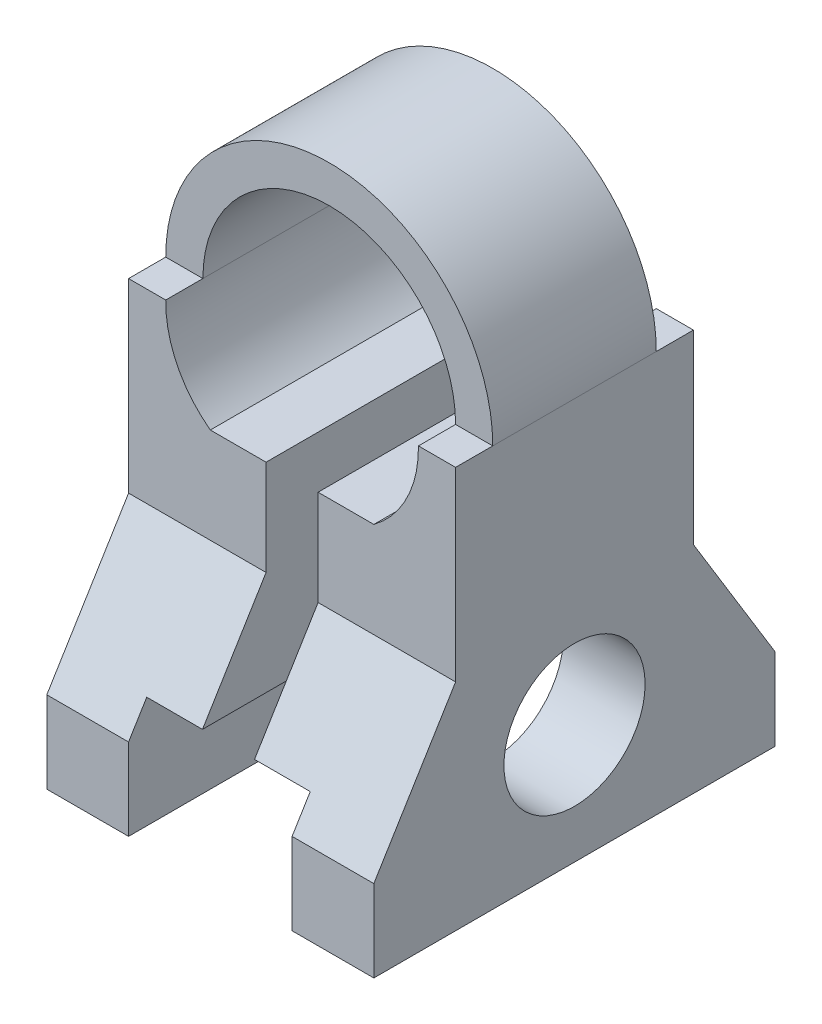
ISO-10303-21;
HEADER;
FILE_DESCRIPTION(('STEP AP214'),'2;1');
FILE_NAME('part.step','',(''),(''),'','','');
FILE_SCHEMA(('AUTOMOTIVE_DESIGN { 1 0 10303 214 1 1 1 1 }'));
ENDSEC;
DATA;
#1=APPLICATION_CONTEXT('core data for automotive mechanical design processes');
#2=APPLICATION_PROTOCOL_DEFINITION('international standard','automotive_design',2000,#1);
#3=PRODUCT_CONTEXT('',#1,'mechanical');
#4=PRODUCT('Part','Part','',(#3));
#5=PRODUCT_RELATED_PRODUCT_CATEGORY('part','',(#4));
#6=PRODUCT_DEFINITION_FORMATION('','',#4);
#7=PRODUCT_DEFINITION_CONTEXT('part definition',#1,'design');
#8=PRODUCT_DEFINITION('design','',#6,#7);
#9=PRODUCT_DEFINITION_SHAPE('','',#8);
#10=(LENGTH_UNIT() NAMED_UNIT(*) SI_UNIT(.MILLI.,.METRE.));
#11=(NAMED_UNIT(*) PLANE_ANGLE_UNIT() SI_UNIT($,.RADIAN.));
#12=(NAMED_UNIT(*) SI_UNIT($,.STERADIAN.) SOLID_ANGLE_UNIT());
#13=UNCERTAINTY_MEASURE_WITH_UNIT(LENGTH_MEASURE(1.E-05),#10,'distance_accuracy_value','');
#14=(GEOMETRIC_REPRESENTATION_CONTEXT(3) GLOBAL_UNCERTAINTY_ASSIGNED_CONTEXT((#13)) GLOBAL_UNIT_ASSIGNED_CONTEXT((#10,
#11,#12)) REPRESENTATION_CONTEXT('',''));
#15=CARTESIAN_POINT('',(0.,0.,0.));
#16=DIRECTION('',(0.,0.,1.));
#17=DIRECTION('',(1.,0.,0.));
#18=AXIS2_PLACEMENT_3D('',#15,#16,#17);
#19=CARTESIAN_POINT('',(-18.5,15.,26.3915962500495));
#20=DIRECTION('',(0.,1.,0.));
#21=DIRECTION('',(0.,0.,1.));
#22=AXIS2_PLACEMENT_3D('',#19,#20,#21);
#23=PLANE('',#22);
#24=DIRECTION('',(0.,0.,1.));
#25=VECTOR('',#24,1.);
#26=CARTESIAN_POINT('',(-18.5,15.,26.3915962500495));
#27=LINE('',#26,#25);
#28=CARTESIAN_POINT('',(-18.5,15.,11.2832625083395));
#29=VERTEX_POINT('',#28);
#30=CARTESIAN_POINT('',(-18.5,15.,26.3915962500495));
#31=VERTEX_POINT('',#30);
#32=EDGE_CURVE('E399',#29,#31,#27,.T.);
#33=ORIENTED_EDGE('',*,*,#32,.F.);
#34=DIRECTION('',(1.,0.,0.));
#35=VECTOR('',#34,1.);
#36=CARTESIAN_POINT('',(-44.,15.,11.2832625083395));
#37=LINE('',#36,#35);
#38=CARTESIAN_POINT('',(-11.,15.,11.2832625083395));
#39=VERTEX_POINT('',#38);
#40=EDGE_CURVE('E52',#29,#39,#37,.T.);
#41=ORIENTED_EDGE('',*,*,#40,.T.);
#42=DIRECTION('',(0.,0.,1.));
#43=VECTOR('',#42,1.);
#44=CARTESIAN_POINT('',(-11.,15.,26.3915962500495));
#45=LINE('',#44,#43);
#46=CARTESIAN_POINT('',(-11.,15.,26.3915962500495));
#47=VERTEX_POINT('',#46);
#48=EDGE_CURVE('E392',#39,#47,#45,.T.);
#49=ORIENTED_EDGE('',*,*,#48,.T.);
#50=DIRECTION('',(1.,0.,0.));
#51=VECTOR('',#50,1.);
#52=CARTESIAN_POINT('',(-18.5,15.,26.3915962500495));
#53=LINE('',#52,#51);
#54=EDGE_CURVE('E407',#31,#47,#53,.T.);
#55=ORIENTED_EDGE('',*,*,#54,.F.);
#56=EDGE_LOOP('',(#33,#41,#49,#55));
#57=FACE_BOUND('',#56,.T.);
#58=ADVANCED_FACE('F37',(#57),#23,.F.);
#59=CARTESIAN_POINT('',(-25.5,15.,26.3915962500495));
#60=DIRECTION('',(0.,1.,0.));
#61=DIRECTION('',(0.,0.,1.));
#62=AXIS2_PLACEMENT_3D('',#59,#60,#61);
#63=PLANE('',#62);
#64=DIRECTION('',(0.,0.,1.));
#65=VECTOR('',#64,1.);
#66=CARTESIAN_POINT('',(-33.,15.,26.3915962500495));
#67=LINE('',#66,#65);
#68=CARTESIAN_POINT('',(-33.,15.,11.2832625083395));
#69=VERTEX_POINT('',#68);
#70=CARTESIAN_POINT('',(-33.,15.,26.3915962500495));
#71=VERTEX_POINT('',#70);
#72=EDGE_CURVE('E256',#69,#71,#67,.T.);
#73=ORIENTED_EDGE('',*,*,#72,.F.);
#74=DIRECTION('',(1.,0.,0.));
#75=VECTOR('',#74,1.);
#76=CARTESIAN_POINT('',(-44.,15.,11.2832625083395));
#77=LINE('',#76,#75);
#78=CARTESIAN_POINT('',(-25.5,15.,11.2832625083395));
#79=VERTEX_POINT('',#78);
#80=EDGE_CURVE('E245',#69,#79,#77,.T.);
#81=ORIENTED_EDGE('',*,*,#80,.T.);
#82=DIRECTION('',(0.,0.,1.));
#83=VECTOR('',#82,1.);
#84=CARTESIAN_POINT('',(-25.5,15.,26.3915962500495));
#85=LINE('',#84,#83);
#86=CARTESIAN_POINT('',(-25.5,15.,26.3915962500495));
#87=VERTEX_POINT('',#86);
#88=EDGE_CURVE('E254',#79,#87,#85,.T.);
#89=ORIENTED_EDGE('',*,*,#88,.T.);
#90=DIRECTION('',(-1.,0.,0.));
#91=VECTOR('',#90,1.);
#92=CARTESIAN_POINT('',(-25.5,15.,26.3915962500495));
#93=LINE('',#92,#91);
#94=EDGE_CURVE('E272',#87,#71,#93,.T.);
#95=ORIENTED_EDGE('',*,*,#94,.T.);
#96=EDGE_LOOP('',(#73,#81,#89,#95));
#97=FACE_BOUND('',#96,.T.);
#98=ADVANCED_FACE('F252',(#97),#63,.F.);
#99=CARTESIAN_POINT('',(-11.,54.,17.8360406944939));
#100=DIRECTION('',(0.,1.,0.));
#101=DIRECTION('',(0.,0.,1.));
#102=AXIS2_PLACEMENT_3D('',#99,#100,#101);
#103=PLANE('',#102);
#104=DIRECTION('',(0.,0.,1.));
#105=VECTOR('',#104,1.);
#106=CARTESIAN_POINT('',(0.,54.,17.8360406944939));
#107=LINE('',#106,#105);
#108=CARTESIAN_POINT('',(0.,54.,12.8360406944939));
#109=VERTEX_POINT('',#108);
#110=CARTESIAN_POINT('',(0.,54.,17.8360406944939));
#111=VERTEX_POINT('',#110);
#112=EDGE_CURVE('E443',#109,#111,#107,.T.);
#113=ORIENTED_EDGE('',*,*,#112,.F.);
#114=DIRECTION('',(1.,0.,0.));
#115=VECTOR('',#114,1.);
#116=CARTESIAN_POINT('',(-5.,54.,12.8360406944939));
#117=LINE('',#116,#115);
#118=CARTESIAN_POINT('',(-5.,54.,12.8360406944939));
#119=VERTEX_POINT('',#118);
#120=EDGE_CURVE('E340',#119,#109,#117,.T.);
#121=ORIENTED_EDGE('',*,*,#120,.F.);
#122=DIRECTION('',(0.,0.,1.));
#123=VECTOR('',#122,1.);
#124=CARTESIAN_POINT('',(-5.,54.,-14.1639593055061));
#125=LINE('',#124,#123);
#126=CARTESIAN_POINT('',(-5.,54.,17.8360406944939));
#127=VERTEX_POINT('',#126);
#128=EDGE_CURVE('E386',#119,#127,#125,.T.);
#129=ORIENTED_EDGE('',*,*,#128,.T.);
#130=DIRECTION('',(1.,0.,0.));
#131=VECTOR('',#130,1.);
#132=CARTESIAN_POINT('',(-11.,54.,17.8360406944939));
#133=LINE('',#132,#131);
#134=EDGE_CURVE('E460',#127,#111,#133,.T.);
#135=ORIENTED_EDGE('',*,*,#134,.T.);
#136=EDGE_LOOP('',(#113,#121,#129,#135));
#137=FACE_BOUND('',#136,.T.);
#138=ADVANCED_FACE('F626',(#137),#103,.T.);
#139=CARTESIAN_POINT('',(-11.,29.,17.8360406944939));
#140=DIRECTION('',(0.,0.,1.));
#141=DIRECTION('',(1.,0.,0.));
#142=AXIS2_PLACEMENT_3D('',#139,#140,#141);
#143=PLANE('',#142);
#144=ORIENTED_EDGE('',*,*,#134,.F.);
#145=CARTESIAN_POINT('',(-19.8242238552265,53.7668014697038,17.8360406944939));
#146=DIRECTION('',(0.,0.,1.));
#147=DIRECTION('',(1.,0.,0.));
#148=AXIS2_PLACEMENT_3D('',#145,#146,#147);
#149=CIRCLE('',#148,14.8260579543046);
#150=CARTESIAN_POINT('',(-11.,41.8527313080315,17.8360406944939));
#151=VERTEX_POINT('',#150);
#152=EDGE_CURVE('E382',#127,#151,#149,.F.);
#153=ORIENTED_EDGE('',*,*,#152,.T.);
#154=DIRECTION('',(-1.,0.,0.));
#155=VECTOR('',#154,1.);
#156=CARTESIAN_POINT('',(-18.5,41.8527313080315,17.8360406944939));
#157=LINE('',#156,#155);
#158=CARTESIAN_POINT('',(-18.5,41.8527313080315,17.8360406944939));
#159=VERTEX_POINT('',#158);
#160=EDGE_CURVE('E361',#151,#159,#157,.T.);
#161=ORIENTED_EDGE('',*,*,#160,.T.);
#162=DIRECTION('',(0.,-1.,0.));
#163=VECTOR('',#162,1.);
#164=CARTESIAN_POINT('',(-18.5,29.,17.8360406944939));
#165=LINE('',#164,#163);
#166=CARTESIAN_POINT('',(-18.5,29.,17.8360406944939));
#167=VERTEX_POINT('',#166);
#168=EDGE_CURVE('E373',#159,#167,#165,.T.);
#169=ORIENTED_EDGE('',*,*,#168,.T.);
#170=DIRECTION('',(1.,0.,0.));
#171=VECTOR('',#170,1.);
#172=CARTESIAN_POINT('',(-11.,29.,17.8360406944939));
#173=LINE('',#172,#171);
#174=CARTESIAN_POINT('',(0.,29.,17.8360406944939));
#175=VERTEX_POINT('',#174);
#176=EDGE_CURVE('E458',#167,#175,#173,.T.);
#177=ORIENTED_EDGE('',*,*,#176,.T.);
#178=DIRECTION('',(0.,-1.,0.));
#179=VECTOR('',#178,1.);
#180=CARTESIAN_POINT('',(0.,29.,17.8360406944939));
#181=LINE('',#180,#179);
#182=EDGE_CURVE('E447',#111,#175,#181,.T.);
#183=ORIENTED_EDGE('',*,*,#182,.F.);
#184=EDGE_LOOP('',(#144,#153,#161,#169,#177,#183));
#185=FACE_BOUND('',#184,.T.);
#186=ADVANCED_FACE('F650',(#185),#143,.T.);
#187=DIRECTION('',(1.,0.,0.));
#188=VECTOR('',#187,1.);
#189=CARTESIAN_POINT('',(-5.,54.,-9.1639593055061));
#190=LINE('',#189,#188);
#191=CARTESIAN_POINT('',(-5.,54.,-9.1639593055061));
#192=VERTEX_POINT('',#191);
#193=CARTESIAN_POINT('',(0.,54.,-9.1639593055061));
#194=VERTEX_POINT('',#193);
#195=EDGE_CURVE('E345',#192,#194,#190,.T.);
#196=ORIENTED_EDGE('',*,*,#195,.T.);
#197=CARTESIAN_POINT('',(0.,54.,-14.1639593055061));
#198=VERTEX_POINT('',#197);
#199=EDGE_CURVE('E444',#198,#194,#107,.T.);
#200=ORIENTED_EDGE('',*,*,#199,.F.);
#201=DIRECTION('',(1.,0.,0.));
#202=VECTOR('',#201,1.);
#203=CARTESIAN_POINT('',(-11.,54.,-14.1639593055061));
#204=LINE('',#203,#202);
#205=CARTESIAN_POINT('',(-5.,54.,-14.1639593055061));
#206=VERTEX_POINT('',#205);
#207=EDGE_CURVE('E463',#206,#198,#204,.T.);
#208=ORIENTED_EDGE('',*,*,#207,.F.);
#209=EDGE_CURVE('E393',#206,#192,#125,.T.);
#210=ORIENTED_EDGE('',*,*,#209,.T.);
#211=EDGE_LOOP('',(#196,#200,#208,#210));
#212=FACE_BOUND('',#211,.T.);
#213=ADVANCED_FACE('F653',(#212),#103,.T.);
#214=CARTESIAN_POINT('',(-11.,54.,-14.1639593055061));
#215=DIRECTION('',(0.,0.,-1.));
#216=DIRECTION('',(0.,1.,0.));
#217=AXIS2_PLACEMENT_3D('',#214,#215,#216);
#218=PLANE('',#217);
#219=DIRECTION('',(1.,0.,0.));
#220=VECTOR('',#219,1.);
#221=CARTESIAN_POINT('',(-11.,29.,-14.1639593055061));
#222=LINE('',#221,#220);
#223=CARTESIAN_POINT('',(-18.5,29.,-14.1639593055061));
#224=VERTEX_POINT('',#223);
#225=CARTESIAN_POINT('',(0.,29.,-14.1639593055061));
#226=VERTEX_POINT('',#225);
#227=EDGE_CURVE('E465',#224,#226,#222,.T.);
#228=ORIENTED_EDGE('',*,*,#227,.F.);
#229=DIRECTION('',(0.,-1.,0.));
#230=VECTOR('',#229,1.);
#231=CARTESIAN_POINT('',(-18.5,29.,-14.1639593055061));
#232=LINE('',#231,#230);
#233=CARTESIAN_POINT('',(-18.5,41.8527313080315,-14.1639593055061));
#234=VERTEX_POINT('',#233);
#235=EDGE_CURVE('E372',#234,#224,#232,.T.);
#236=ORIENTED_EDGE('',*,*,#235,.F.);
#237=DIRECTION('',(-1.,0.,0.));
#238=VECTOR('',#237,1.);
#239=CARTESIAN_POINT('',(-18.5,41.8527313080315,-14.1639593055061));
#240=LINE('',#239,#238);
#241=CARTESIAN_POINT('',(-11.,41.8527313080315,-14.1639593055061));
#242=VERTEX_POINT('',#241);
#243=EDGE_CURVE('E369',#242,#234,#240,.T.);
#244=ORIENTED_EDGE('',*,*,#243,.F.);
#245=CARTESIAN_POINT('',(-19.8242238552265,53.7668014697038,-14.1639593055061));
#246=DIRECTION('',(0.,0.,1.));
#247=DIRECTION('',(1.,0.,0.));
#248=AXIS2_PLACEMENT_3D('',#245,#246,#247);
#249=CIRCLE('',#248,14.8260579543046);
#250=EDGE_CURVE('E383',#206,#242,#249,.F.);
#251=ORIENTED_EDGE('',*,*,#250,.F.);
#252=ORIENTED_EDGE('',*,*,#207,.T.);
#253=DIRECTION('',(0.,1.,0.));
#254=VECTOR('',#253,1.);
#255=CARTESIAN_POINT('',(0.,54.,-14.1639593055061));
#256=LINE('',#255,#254);
#257=EDGE_CURVE('E440',#226,#198,#256,.T.);
#258=ORIENTED_EDGE('',*,*,#257,.F.);
#259=EDGE_LOOP('',(#228,#236,#244,#251,#252,#258));
#260=FACE_BOUND('',#259,.T.);
#261=ADVANCED_FACE('F502',(#260),#218,.T.);
#262=CARTESIAN_POINT('',(-11.,0.,-25.1639593055061));
#263=DIRECTION('',(0.,-1.,0.));
#264=DIRECTION('',(0.,0.,-1.));
#265=AXIS2_PLACEMENT_3D('',#262,#263,#264);
#266=PLANE('',#265);
#267=DIRECTION('',(0.,0.,-1.));
#268=VECTOR('',#267,1.);
#269=CARTESIAN_POINT('',(0.,0.,-25.1639593055061));
#270=LINE('',#269,#268);
#271=CARTESIAN_POINT('',(0.,0.,28.8360406944939));
#272=VERTEX_POINT('',#271);
#273=CARTESIAN_POINT('',(0.,0.,-25.1639593055061));
#274=VERTEX_POINT('',#273);
#275=EDGE_CURVE('E415',#272,#274,#270,.T.);
#276=ORIENTED_EDGE('',*,*,#275,.F.);
#277=DIRECTION('',(1.,0.,0.));
#278=VECTOR('',#277,1.);
#279=CARTESIAN_POINT('',(-11.,0.,28.8360406944939));
#280=LINE('',#279,#278);
#281=CARTESIAN_POINT('',(-11.,0.,28.8360406944939));
#282=VERTEX_POINT('',#281);
#283=EDGE_CURVE('E45',#282,#272,#280,.T.);
#284=ORIENTED_EDGE('',*,*,#283,.F.);
#285=DIRECTION('',(0.,0.,-1.));
#286=VECTOR('',#285,1.);
#287=CARTESIAN_POINT('',(-11.,0.,-25.1639593055061));
#288=LINE('',#287,#286);
#289=CARTESIAN_POINT('',(-11.,0.,-25.1639593055061));
#290=VERTEX_POINT('',#289);
#291=EDGE_CURVE('E416',#282,#290,#288,.T.);
#292=ORIENTED_EDGE('',*,*,#291,.T.);
#293=DIRECTION('',(1.,0.,0.));
#294=VECTOR('',#293,1.);
#295=CARTESIAN_POINT('',(-11.,0.,-25.1639593055061));
#296=LINE('',#295,#294);
#297=EDGE_CURVE('E431',#290,#274,#296,.T.);
#298=ORIENTED_EDGE('',*,*,#297,.T.);
#299=EDGE_LOOP('',(#276,#284,#292,#298));
#300=FACE_BOUND('',#299,.T.);
#301=ADVANCED_FACE('F39',(#300),#266,.T.);
#302=CARTESIAN_POINT('',(-11.,0.,28.8360406944939));
#303=DIRECTION('',(0.,0.,1.));
#304=DIRECTION('',(1.,0.,0.));
#305=AXIS2_PLACEMENT_3D('',#302,#303,#304);
#306=PLANE('',#305);
#307=DIRECTION('',(0.,-1.,0.));
#308=VECTOR('',#307,1.);
#309=CARTESIAN_POINT('',(0.,0.,28.8360406944939));
#310=LINE('',#309,#308);
#311=CARTESIAN_POINT('',(0.,11.,28.8360406944939));
#312=VERTEX_POINT('',#311);
#313=EDGE_CURVE('E420',#312,#272,#310,.T.);
#314=ORIENTED_EDGE('',*,*,#313,.F.);
#315=DIRECTION('',(1.,0.,0.));
#316=VECTOR('',#315,1.);
#317=CARTESIAN_POINT('',(-11.,11.,28.8360406944939));
#318=LINE('',#317,#316);
#319=CARTESIAN_POINT('',(-11.,11.,28.8360406944939));
#320=VERTEX_POINT('',#319);
#321=EDGE_CURVE('E456',#320,#312,#318,.T.);
#322=ORIENTED_EDGE('',*,*,#321,.F.);
#323=DIRECTION('',(0.,-1.,0.));
#324=VECTOR('',#323,1.);
#325=CARTESIAN_POINT('',(-11.,0.,28.8360406944939));
#326=LINE('',#325,#324);
#327=EDGE_CURVE('E428',#320,#282,#326,.T.);
#328=ORIENTED_EDGE('',*,*,#327,.T.);
#329=ORIENTED_EDGE('',*,*,#283,.T.);
#330=EDGE_LOOP('',(#314,#322,#328,#329));
#331=FACE_BOUND('',#330,.T.);
#332=ADVANCED_FACE('F482',(#331),#306,.T.);
#333=CARTESIAN_POINT('',(-11.,11.,28.8360406944939));
#334=DIRECTION('',(0.,0.521450009453975,0.853281833651959));
#335=DIRECTION('',(0.,-0.853281833651959,0.521450009453975));
#336=AXIS2_PLACEMENT_3D('',#333,#334,#335);
#337=PLANE('',#336);
#338=DIRECTION('',(0.,-0.853281833651959,0.521450009453975));
#339=VECTOR('',#338,1.);
#340=CARTESIAN_POINT('',(0.,11.,28.8360406944939));
#341=LINE('',#340,#339);
#342=EDGE_CURVE('E450',#175,#312,#341,.T.);
#343=ORIENTED_EDGE('',*,*,#342,.F.);
#344=ORIENTED_EDGE('',*,*,#176,.F.);
#345=DIRECTION('',(0.,0.853281833651959,-0.521450009453975));
#346=VECTOR('',#345,1.);
#347=CARTESIAN_POINT('',(-18.5,29.,17.8360406944939));
#348=LINE('',#347,#346);
#349=EDGE_CURVE('E404',#31,#167,#348,.T.);
#350=ORIENTED_EDGE('',*,*,#349,.F.);
#351=ORIENTED_EDGE('',*,*,#54,.T.);
#352=DIRECTION('',(0.,-0.853281833651959,0.521450009453975));
#353=VECTOR('',#352,1.);
#354=CARTESIAN_POINT('',(-11.,11.,28.8360406944939));
#355=LINE('',#354,#353);
#356=EDGE_CURVE('E426',#47,#320,#355,.T.);
#357=ORIENTED_EDGE('',*,*,#356,.T.);
#358=ORIENTED_EDGE('',*,*,#321,.T.);
#359=EDGE_LOOP('',(#343,#344,#350,#351,#357,#358));
#360=FACE_BOUND('',#359,.T.);
#361=ADVANCED_FACE('F646',(#360),#337,.T.);
#362=CARTESIAN_POINT('',(-11.,29.,-14.1639593055061));
#363=DIRECTION('',(0.,0.521450009453975,-0.853281833651959));
#364=DIRECTION('',(0.,0.853281833651959,0.521450009453975));
#365=AXIS2_PLACEMENT_3D('',#362,#363,#364);
#366=PLANE('',#365);
#367=DIRECTION('',(0.,0.853281833651959,0.521450009453975));
#368=VECTOR('',#367,1.);
#369=CARTESIAN_POINT('',(0.,29.,-14.1639593055061));
#370=LINE('',#369,#368);
#371=CARTESIAN_POINT('',(0.,11.,-25.1639593055061));
#372=VERTEX_POINT('',#371);
#373=EDGE_CURVE('E437',#372,#226,#370,.T.);
#374=ORIENTED_EDGE('',*,*,#373,.F.);
#375=DIRECTION('',(1.,0.,0.));
#376=VECTOR('',#375,1.);
#377=CARTESIAN_POINT('',(-11.,11.,-25.1639593055061));
#378=LINE('',#377,#376);
#379=CARTESIAN_POINT('',(-11.,11.,-25.1639593055061));
#380=VERTEX_POINT('',#379);
#381=EDGE_CURVE('E467',#380,#372,#378,.T.);
#382=ORIENTED_EDGE('',*,*,#381,.F.);
#383=DIRECTION('',(0.,0.853281833651959,0.521450009453975));
#384=VECTOR('',#383,1.);
#385=CARTESIAN_POINT('',(-11.,29.,-14.1639593055061));
#386=LINE('',#385,#384);
#387=CARTESIAN_POINT('',(-11.,15.,-22.7195148610616));
#388=VERTEX_POINT('',#387);
#389=EDGE_CURVE('E423',#380,#388,#386,.T.);
#390=ORIENTED_EDGE('',*,*,#389,.T.);
#391=DIRECTION('',(1.,0.,0.));
#392=VECTOR('',#391,1.);
#393=CARTESIAN_POINT('',(-18.5,15.,-22.7195148610617));
#394=LINE('',#393,#392);
#395=CARTESIAN_POINT('',(-18.5,15.,-22.7195148610617));
#396=VERTEX_POINT('',#395);
#397=EDGE_CURVE('E412',#396,#388,#394,.T.);
#398=ORIENTED_EDGE('',*,*,#397,.F.);
#399=DIRECTION('',(0.,-0.853281833651959,-0.521450009453975));
#400=VECTOR('',#399,1.);
#401=CARTESIAN_POINT('',(-18.5,15.,-22.7195148610617));
#402=LINE('',#401,#400);
#403=EDGE_CURVE('E396',#224,#396,#402,.T.);
#404=ORIENTED_EDGE('',*,*,#403,.F.);
#405=ORIENTED_EDGE('',*,*,#227,.T.);
#406=EDGE_LOOP('',(#374,#382,#390,#398,#404,#405));
#407=FACE_BOUND('',#406,.T.);
#408=ADVANCED_FACE('F491',(#407),#366,.T.);
#409=CARTESIAN_POINT('',(-11.,11.,-25.1639593055061));
#410=DIRECTION('',(0.,0.,-1.));
#411=DIRECTION('',(-1.,0.,0.));
#412=AXIS2_PLACEMENT_3D('',#409,#410,#411);
#413=PLANE('',#412);
#414=DIRECTION('',(0.,1.,0.));
#415=VECTOR('',#414,1.);
#416=CARTESIAN_POINT('',(0.,11.,-25.1639593055061));
#417=LINE('',#416,#415);
#418=EDGE_CURVE('E434',#274,#372,#417,.T.);
#419=ORIENTED_EDGE('',*,*,#418,.F.);
#420=ORIENTED_EDGE('',*,*,#297,.F.);
#421=DIRECTION('',(0.,1.,0.));
#422=VECTOR('',#421,1.);
#423=CARTESIAN_POINT('',(-11.,11.,-25.1639593055061));
#424=LINE('',#423,#422);
#425=EDGE_CURVE('E419',#290,#380,#424,.T.);
#426=ORIENTED_EDGE('',*,*,#425,.T.);
#427=ORIENTED_EDGE('',*,*,#381,.T.);
#428=EDGE_LOOP('',(#419,#420,#426,#427));
#429=FACE_BOUND('',#428,.T.);
#430=ADVANCED_FACE('F474',(#429),#413,.T.);
#431=CARTESIAN_POINT('',(-11.,0.,0.));
#432=DIRECTION('',(-1.,0.,0.));
#433=DIRECTION('',(0.,0.,1.));
#434=AXIS2_PLACEMENT_3D('',#431,#432,#433);
#435=PLANE('',#434);
#436=CARTESIAN_POINT('',(-11.,16.,1.8360406944939));
#437=DIRECTION('',(-1.,0.,0.));
#438=DIRECTION('',(0.,0.,1.));
#439=AXIS2_PLACEMENT_3D('',#436,#437,#438);
#440=CIRCLE('',#439,9.5);
#441=CARTESIAN_POINT('',(-11.,15.,-7.61118111935169));
#442=VERTEX_POINT('',#441);
#443=EDGE_CURVE('E600',#442,#39,#440,.T.);
#444=ORIENTED_EDGE('',*,*,#443,.F.);
#445=EDGE_CURVE('E400',#388,#442,#45,.T.);
#446=ORIENTED_EDGE('',*,*,#445,.F.);
#447=ORIENTED_EDGE('',*,*,#389,.F.);
#448=ORIENTED_EDGE('',*,*,#425,.F.);
#449=ORIENTED_EDGE('',*,*,#291,.F.);
#450=ORIENTED_EDGE('',*,*,#327,.F.);
#451=ORIENTED_EDGE('',*,*,#356,.F.);
#452=ORIENTED_EDGE('',*,*,#48,.F.);
#453=EDGE_LOOP('',(#444,#446,#447,#448,#449,#450,#451,#452));
#454=FACE_BOUND('',#453,.T.);
#455=ADVANCED_FACE('F486',(#454),#435,.T.);
#456=CARTESIAN_POINT('',(0.,0.,0.));
#457=DIRECTION('',(-1.,0.,0.));
#458=DIRECTION('',(0.,0.,1.));
#459=AXIS2_PLACEMENT_3D('',#456,#457,#458);
#460=PLANE('',#459);
#461=CARTESIAN_POINT('',(0.,16.,1.8360406944939));
#462=DIRECTION('',(1.,0.,0.));
#463=DIRECTION('',(0.,0.,-1.));
#464=AXIS2_PLACEMENT_3D('',#461,#462,#463);
#465=CIRCLE('',#464,9.5);
#466=CARTESIAN_POINT('',(0.,16.,-7.6639593055061));
#467=VERTEX_POINT('',#466);
#468=EDGE_CURVE('E591',#467,#467,#465,.T.);
#469=ORIENTED_EDGE('',*,*,#468,.F.);
#470=EDGE_LOOP('',(#469));
#471=FACE_BOUND('',#470,.T.);
#472=ORIENTED_EDGE('',*,*,#275,.T.);
#473=ORIENTED_EDGE('',*,*,#418,.T.);
#474=ORIENTED_EDGE('',*,*,#373,.T.);
#475=ORIENTED_EDGE('',*,*,#257,.T.);
#476=ORIENTED_EDGE('',*,*,#199,.T.);
#477=DIRECTION('',(0.,0.,1.));
#478=VECTOR('',#477,1.);
#479=CARTESIAN_POINT('',(0.,54.,-9.1639593055061));
#480=LINE('',#479,#478);
#481=EDGE_CURVE('E358',#194,#109,#480,.T.);
#482=ORIENTED_EDGE('',*,*,#481,.T.);
#483=ORIENTED_EDGE('',*,*,#112,.T.);
#484=ORIENTED_EDGE('',*,*,#182,.T.);
#485=ORIENTED_EDGE('',*,*,#342,.T.);
#486=ORIENTED_EDGE('',*,*,#313,.T.);
#487=EDGE_LOOP('',(#472,#473,#474,#475,#476,#482,#483,#484,#485,#486));
#488=FACE_BOUND('',#487,.T.);
#489=ADVANCED_FACE('F477',(#471,#488),#460,.F.);
#490=ORIENTED_EDGE('',*,*,#445,.T.);
#491=DIRECTION('',(1.,0.,0.));
#492=VECTOR('',#491,1.);
#493=CARTESIAN_POINT('',(-44.,15.,-7.61118111935169));
#494=LINE('',#493,#492);
#495=CARTESIAN_POINT('',(-18.5,15.,-7.61118111935169));
#496=VERTEX_POINT('',#495);
#497=EDGE_CURVE('E496',#442,#496,#494,.F.);
#498=ORIENTED_EDGE('',*,*,#497,.T.);
#499=EDGE_CURVE('E401',#396,#496,#27,.T.);
#500=ORIENTED_EDGE('',*,*,#499,.F.);
#501=ORIENTED_EDGE('',*,*,#397,.T.);
#502=EDGE_LOOP('',(#490,#498,#500,#501));
#503=FACE_BOUND('',#502,.T.);
#504=ADVANCED_FACE('F494',(#503),#23,.F.);
#505=CARTESIAN_POINT('',(-18.5,0.,0.));
#506=DIRECTION('',(1.,0.,0.));
#507=DIRECTION('',(0.,0.,-1.));
#508=AXIS2_PLACEMENT_3D('',#505,#506,#507);
#509=PLANE('',#508);
#510=ORIENTED_EDGE('',*,*,#499,.T.);
#511=CARTESIAN_POINT('',(-18.5,16.,1.8360406944939));
#512=DIRECTION('',(1.,0.,0.));
#513=DIRECTION('',(0.,0.,-1.));
#514=AXIS2_PLACEMENT_3D('',#511,#512,#513);
#515=CIRCLE('',#514,9.5);
#516=EDGE_CURVE('E596',#496,#29,#515,.T.);
#517=ORIENTED_EDGE('',*,*,#516,.T.);
#518=ORIENTED_EDGE('',*,*,#32,.T.);
#519=ORIENTED_EDGE('',*,*,#349,.T.);
#520=ORIENTED_EDGE('',*,*,#168,.F.);
#521=DIRECTION('',(0.,0.,1.));
#522=VECTOR('',#521,1.);
#523=CARTESIAN_POINT('',(-18.5,41.8527313080315,-14.1639593055061));
#524=LINE('',#523,#522);
#525=EDGE_CURVE('E376',#234,#159,#524,.T.);
#526=ORIENTED_EDGE('',*,*,#525,.F.);
#527=ORIENTED_EDGE('',*,*,#235,.T.);
#528=ORIENTED_EDGE('',*,*,#403,.T.);
#529=EDGE_LOOP('',(#510,#517,#518,#519,#520,#526,#527,#528));
#530=FACE_BOUND('',#529,.T.);
#531=ADVANCED_FACE('F498',(#530),#509,.F.);
#532=CARTESIAN_POINT('',(-19.8242238552265,53.7668014697038,-14.1639593055061));
#533=DIRECTION('',(0.,0.,1.));
#534=DIRECTION('',(1.,0.,0.));
#535=AXIS2_PLACEMENT_3D('',#532,#533,#534);
#536=CYLINDRICAL_SURFACE('',#535,14.8260579543046);
#537=ORIENTED_EDGE('',*,*,#152,.F.);
#538=ORIENTED_EDGE('',*,*,#128,.F.);
#539=DIRECTION('',(0.,0.,1.));
#540=VECTOR('',#539,1.);
#541=CARTESIAN_POINT('',(-5.,54.,-9.1639593055061));
#542=LINE('',#541,#540);
#543=EDGE_CURVE('E362',#192,#119,#542,.T.);
#544=ORIENTED_EDGE('',*,*,#543,.F.);
#545=ORIENTED_EDGE('',*,*,#209,.F.);
#546=ORIENTED_EDGE('',*,*,#250,.T.);
#547=DIRECTION('',(0.,0.,1.));
#548=VECTOR('',#547,1.);
#549=CARTESIAN_POINT('',(-11.,41.8527313080315,-14.1639593055061));
#550=LINE('',#549,#548);
#551=EDGE_CURVE('E389',#242,#151,#550,.T.);
#552=ORIENTED_EDGE('',*,*,#551,.T.);
#553=EDGE_LOOP('',(#537,#538,#544,#545,#546,#552));
#554=FACE_BOUND('',#553,.T.);
#555=ADVANCED_FACE('F636',(#554),#536,.F.);
#556=CARTESIAN_POINT('',(-18.5,41.8527313080315,-14.1639593055061));
#557=DIRECTION('',(0.,1.,0.));
#558=DIRECTION('',(0.,0.,1.));
#559=AXIS2_PLACEMENT_3D('',#556,#557,#558);
#560=PLANE('',#559);
#561=ORIENTED_EDGE('',*,*,#160,.F.);
#562=ORIENTED_EDGE('',*,*,#551,.F.);
#563=ORIENTED_EDGE('',*,*,#243,.T.);
#564=ORIENTED_EDGE('',*,*,#525,.T.);
#565=EDGE_LOOP('',(#561,#562,#563,#564));
#566=FACE_BOUND('',#565,.T.);
#567=ADVANCED_FACE('F792',(#566),#560,.T.);
#568=CARTESIAN_POINT('',(-22.,53.9999988167024,-9.1639593055061));
#569=DIRECTION('',(0.,0.,1.));
#570=DIRECTION('',(1.,0.,0.));
#571=AXIS2_PLACEMENT_3D('',#568,#569,#570);
#572=CYLINDRICAL_SURFACE('',#571,22.);
#573=CARTESIAN_POINT('',(-22.,53.9999988167024,12.8360406944939));
#574=DIRECTION('',(0.,0.,1.));
#575=DIRECTION('',(-1.,0.,0.));
#576=AXIS2_PLACEMENT_3D('',#573,#574,#575);
#577=CIRCLE('',#576,22.);
#578=CARTESIAN_POINT('',(-44.,54.,12.8360406944939));
#579=VERTEX_POINT('',#578);
#580=EDGE_CURVE('E315',#109,#579,#577,.T.);
#581=ORIENTED_EDGE('',*,*,#580,.F.);
#582=ORIENTED_EDGE('',*,*,#481,.F.);
#583=CARTESIAN_POINT('',(-22.,53.9999988167024,-9.1639593055061));
#584=DIRECTION('',(0.,0.,1.));
#585=DIRECTION('',(-1.,0.,0.));
#586=AXIS2_PLACEMENT_3D('',#583,#584,#585);
#587=CIRCLE('',#586,22.);
#588=CARTESIAN_POINT('',(-44.,54.,-9.1639593055061));
#589=VERTEX_POINT('',#588);
#590=EDGE_CURVE('E336',#194,#589,#587,.T.);
#591=ORIENTED_EDGE('',*,*,#590,.T.);
#592=DIRECTION('',(0.,0.,1.));
#593=VECTOR('',#592,1.);
#594=CARTESIAN_POINT('',(-44.,54.,-9.1639593055061));
#595=LINE('',#594,#593);
#596=EDGE_CURVE('E347',#589,#579,#595,.T.);
#597=ORIENTED_EDGE('',*,*,#596,.T.);
#598=EDGE_LOOP('',(#581,#582,#591,#597));
#599=FACE_BOUND('',#598,.T.);
#600=ADVANCED_FACE('F511',(#599),#572,.T.);
#601=CARTESIAN_POINT('',(-22.,53.9999988167024,-9.1639593055061));
#602=DIRECTION('',(0.,0.,1.));
#603=DIRECTION('',(1.,0.,0.));
#604=AXIS2_PLACEMENT_3D('',#601,#602,#603);
#605=CYLINDRICAL_SURFACE('',#604,17.);
#606=CARTESIAN_POINT('',(-22.,53.9999988167024,12.8360406944939));
#607=DIRECTION('',(0.,0.,-1.));
#608=DIRECTION('',(-1.,0.,0.));
#609=AXIS2_PLACEMENT_3D('',#606,#607,#608);
#610=CIRCLE('',#609,17.);
#611=CARTESIAN_POINT('',(-39.,54.,12.8360406944939));
#612=VERTEX_POINT('',#611);
#613=EDGE_CURVE('E353',#612,#119,#610,.T.);
#614=ORIENTED_EDGE('',*,*,#613,.F.);
#615=DIRECTION('',(0.,0.,1.));
#616=VECTOR('',#615,1.);
#617=CARTESIAN_POINT('',(-39.,54.,-9.1639593055061));
#618=LINE('',#617,#616);
#619=CARTESIAN_POINT('',(-39.,54.,-9.1639593055061));
#620=VERTEX_POINT('',#619);
#621=EDGE_CURVE('E365',#620,#612,#618,.T.);
#622=ORIENTED_EDGE('',*,*,#621,.F.);
#623=CARTESIAN_POINT('',(-22.,53.9999988167024,-9.1639593055061));
#624=DIRECTION('',(0.,0.,-1.));
#625=DIRECTION('',(-1.,0.,0.));
#626=AXIS2_PLACEMENT_3D('',#623,#624,#625);
#627=CIRCLE('',#626,17.);
#628=EDGE_CURVE('E342',#620,#192,#627,.T.);
#629=ORIENTED_EDGE('',*,*,#628,.T.);
#630=ORIENTED_EDGE('',*,*,#543,.T.);
#631=EDGE_LOOP('',(#614,#622,#629,#630));
#632=FACE_BOUND('',#631,.T.);
#633=ADVANCED_FACE('F535',(#632),#605,.F.);
#634=CARTESIAN_POINT('',(-22.,53.9999988167024,-9.1639593055061));
#635=DIRECTION('',(0.,0.,-1.));
#636=DIRECTION('',(-1.,0.,0.));
#637=AXIS2_PLACEMENT_3D('',#634,#635,#636);
#638=PLANE('',#637);
#639=ORIENTED_EDGE('',*,*,#590,.F.);
#640=ORIENTED_EDGE('',*,*,#195,.F.);
#641=ORIENTED_EDGE('',*,*,#628,.F.);
#642=DIRECTION('',(1.,0.,0.));
#643=VECTOR('',#642,1.);
#644=CARTESIAN_POINT('',(-44.,54.,-9.1639593055061));
#645=LINE('',#644,#643);
#646=EDGE_CURVE('E339',#589,#620,#645,.T.);
#647=ORIENTED_EDGE('',*,*,#646,.F.);
#648=EDGE_LOOP('',(#639,#640,#641,#647));
#649=FACE_BOUND('',#648,.T.);
#650=ADVANCED_FACE('F515',(#649),#638,.T.);
#651=CARTESIAN_POINT('',(-22.,53.9999988167024,12.8360406944939));
#652=DIRECTION('',(0.,0.,-1.));
#653=DIRECTION('',(-1.,0.,0.));
#654=AXIS2_PLACEMENT_3D('',#651,#652,#653);
#655=PLANE('',#654);
#656=ORIENTED_EDGE('',*,*,#580,.T.);
#657=DIRECTION('',(1.,0.,0.));
#658=VECTOR('',#657,1.);
#659=CARTESIAN_POINT('',(-44.,54.,12.8360406944939));
#660=LINE('',#659,#658);
#661=EDGE_CURVE('E350',#579,#612,#660,.T.);
#662=ORIENTED_EDGE('',*,*,#661,.T.);
#663=ORIENTED_EDGE('',*,*,#613,.T.);
#664=ORIENTED_EDGE('',*,*,#120,.T.);
#665=EDGE_LOOP('',(#656,#662,#663,#664));
#666=FACE_BOUND('',#665,.T.);
#667=ADVANCED_FACE('F537',(#666),#655,.F.);
#668=CARTESIAN_POINT('',(-33.,54.,17.8360406944939));
#669=DIRECTION('',(0.,1.,0.));
#670=DIRECTION('',(0.,0.,1.));
#671=AXIS2_PLACEMENT_3D('',#668,#669,#670);
#672=PLANE('',#671);
#673=ORIENTED_EDGE('',*,*,#661,.F.);
#674=DIRECTION('',(0.,0.,1.));
#675=VECTOR('',#674,1.);
#676=CARTESIAN_POINT('',(-44.,54.,17.8360406944939));
#677=LINE('',#676,#675);
#678=CARTESIAN_POINT('',(-44.,54.,17.8360406944939));
#679=VERTEX_POINT('',#678);
#680=EDGE_CURVE('E302',#579,#679,#677,.T.);
#681=ORIENTED_EDGE('',*,*,#680,.T.);
#682=DIRECTION('',(-1.,0.,0.));
#683=VECTOR('',#682,1.);
#684=CARTESIAN_POINT('',(-33.,54.,17.8360406944939));
#685=LINE('',#684,#683);
#686=CARTESIAN_POINT('',(-39.,54.,17.8360406944939));
#687=VERTEX_POINT('',#686);
#688=EDGE_CURVE('E322',#687,#679,#685,.T.);
#689=ORIENTED_EDGE('',*,*,#688,.F.);
#690=DIRECTION('',(0.,0.,1.));
#691=VECTOR('',#690,1.);
#692=CARTESIAN_POINT('',(-39.,54.,-14.1639593055061));
#693=LINE('',#692,#691);
#694=EDGE_CURVE('E532',#612,#687,#693,.T.);
#695=ORIENTED_EDGE('',*,*,#694,.F.);
#696=EDGE_LOOP('',(#673,#681,#689,#695));
#697=FACE_BOUND('',#696,.T.);
#698=ADVANCED_FACE('F540',(#697),#672,.T.);
#699=CARTESIAN_POINT('',(-33.,29.,17.8360406944939));
#700=DIRECTION('',(0.,0.,1.));
#701=DIRECTION('',(-1.,0.,0.));
#702=AXIS2_PLACEMENT_3D('',#699,#700,#701);
#703=PLANE('',#702);
#704=ORIENTED_EDGE('',*,*,#688,.T.);
#705=DIRECTION('',(0.,-1.,0.));
#706=VECTOR('',#705,1.);
#707=CARTESIAN_POINT('',(-44.,29.,17.8360406944939));
#708=LINE('',#707,#706);
#709=CARTESIAN_POINT('',(-44.,29.,17.8360406944939));
#710=VERTEX_POINT('',#709);
#711=EDGE_CURVE('E306',#679,#710,#708,.T.);
#712=ORIENTED_EDGE('',*,*,#711,.T.);
#713=DIRECTION('',(-1.,0.,0.));
#714=VECTOR('',#713,1.);
#715=CARTESIAN_POINT('',(-33.,29.,17.8360406944939));
#716=LINE('',#715,#714);
#717=CARTESIAN_POINT('',(-25.5,29.,17.8360406944939));
#718=VERTEX_POINT('',#717);
#719=EDGE_CURVE('E319',#718,#710,#716,.T.);
#720=ORIENTED_EDGE('',*,*,#719,.F.);
#721=DIRECTION('',(0.,-1.,0.));
#722=VECTOR('',#721,1.);
#723=CARTESIAN_POINT('',(-25.5,29.,17.8360406944939));
#724=LINE('',#723,#722);
#725=CARTESIAN_POINT('',(-25.5,41.8527313080315,17.8360406944939));
#726=VERTEX_POINT('',#725);
#727=EDGE_CURVE('E605',#726,#718,#724,.T.);
#728=ORIENTED_EDGE('',*,*,#727,.F.);
#729=DIRECTION('',(1.,0.,0.));
#730=VECTOR('',#729,1.);
#731=CARTESIAN_POINT('',(-25.5,41.8527313080315,17.8360406944939));
#732=LINE('',#731,#730);
#733=CARTESIAN_POINT('',(-33.,41.8527313080315,17.8360406944939));
#734=VERTEX_POINT('',#733);
#735=EDGE_CURVE('E555',#734,#726,#732,.T.);
#736=ORIENTED_EDGE('',*,*,#735,.F.);
#737=CARTESIAN_POINT('',(-24.1757761447735,53.7668014697038,17.8360406944939));
#738=DIRECTION('',(0.,0.,-1.));
#739=DIRECTION('',(-1.,0.,0.));
#740=AXIS2_PLACEMENT_3D('',#737,#738,#739);
#741=CIRCLE('',#740,14.8260579543046);
#742=EDGE_CURVE('E552',#687,#734,#741,.F.);
#743=ORIENTED_EDGE('',*,*,#742,.F.);
#744=EDGE_LOOP('',(#704,#712,#720,#728,#736,#743));
#745=FACE_BOUND('',#744,.T.);
#746=ADVANCED_FACE('F550',(#745),#703,.T.);
#747=CARTESIAN_POINT('',(-44.,54.,-14.1639593055061));
#748=VERTEX_POINT('',#747);
#749=EDGE_CURVE('E303',#748,#589,#677,.T.);
#750=ORIENTED_EDGE('',*,*,#749,.T.);
#751=ORIENTED_EDGE('',*,*,#646,.T.);
#752=CARTESIAN_POINT('',(-39.,54.,-14.1639593055061));
#753=VERTEX_POINT('',#752);
#754=EDGE_CURVE('E521',#753,#620,#693,.T.);
#755=ORIENTED_EDGE('',*,*,#754,.F.);
#756=DIRECTION('',(-1.,0.,0.));
#757=VECTOR('',#756,1.);
#758=CARTESIAN_POINT('',(-33.,54.,-14.1639593055061));
#759=LINE('',#758,#757);
#760=EDGE_CURVE('E325',#753,#748,#759,.T.);
#761=ORIENTED_EDGE('',*,*,#760,.T.);
#762=EDGE_LOOP('',(#750,#751,#755,#761));
#763=FACE_BOUND('',#762,.T.);
#764=ADVANCED_FACE('F520',(#763),#672,.T.);
#765=CARTESIAN_POINT('',(-33.,54.,-14.1639593055061));
#766=DIRECTION('',(0.,0.,-1.));
#767=DIRECTION('',(0.,1.,0.));
#768=AXIS2_PLACEMENT_3D('',#765,#766,#767);
#769=PLANE('',#768);
#770=DIRECTION('',(-1.,0.,0.));
#771=VECTOR('',#770,1.);
#772=CARTESIAN_POINT('',(-33.,29.,-14.1639593055061));
#773=LINE('',#772,#771);
#774=CARTESIAN_POINT('',(-25.5,29.,-14.1639593055061));
#775=VERTEX_POINT('',#774);
#776=CARTESIAN_POINT('',(-44.,29.,-14.1639593055061));
#777=VERTEX_POINT('',#776);
#778=EDGE_CURVE('E328',#775,#777,#773,.T.);
#779=ORIENTED_EDGE('',*,*,#778,.T.);
#780=DIRECTION('',(0.,1.,0.));
#781=VECTOR('',#780,1.);
#782=CARTESIAN_POINT('',(-44.,54.,-14.1639593055061));
#783=LINE('',#782,#781);
#784=EDGE_CURVE('E300',#777,#748,#783,.T.);
#785=ORIENTED_EDGE('',*,*,#784,.T.);
#786=ORIENTED_EDGE('',*,*,#760,.F.);
#787=CARTESIAN_POINT('',(-24.1757761447735,53.7668014697038,-14.1639593055061));
#788=DIRECTION('',(0.,0.,-1.));
#789=DIRECTION('',(-1.,0.,0.));
#790=AXIS2_PLACEMENT_3D('',#787,#788,#789);
#791=CIRCLE('',#790,14.8260579543046);
#792=CARTESIAN_POINT('',(-33.,41.8527313080315,-14.1639593055061));
#793=VERTEX_POINT('',#792);
#794=EDGE_CURVE('E530',#753,#793,#791,.F.);
#795=ORIENTED_EDGE('',*,*,#794,.T.);
#796=DIRECTION('',(1.,0.,0.));
#797=VECTOR('',#796,1.);
#798=CARTESIAN_POINT('',(-25.5,41.8527313080315,-14.1639593055061));
#799=LINE('',#798,#797);
#800=CARTESIAN_POINT('',(-25.5,41.8527313080315,-14.1639593055061));
#801=VERTEX_POINT('',#800);
#802=EDGE_CURVE('E602',#793,#801,#799,.T.);
#803=ORIENTED_EDGE('',*,*,#802,.T.);
#804=DIRECTION('',(0.,-1.,0.));
#805=VECTOR('',#804,1.);
#806=CARTESIAN_POINT('',(-25.5,29.,-14.1639593055061));
#807=LINE('',#806,#805);
#808=EDGE_CURVE('E559',#801,#775,#807,.T.);
#809=ORIENTED_EDGE('',*,*,#808,.T.);
#810=EDGE_LOOP('',(#779,#785,#786,#795,#803,#809));
#811=FACE_BOUND('',#810,.T.);
#812=ADVANCED_FACE('F845',(#811),#769,.T.);
#813=CARTESIAN_POINT('',(-33.,0.,-25.1639593055061));
#814=DIRECTION('',(0.,-1.,0.));
#815=DIRECTION('',(0.,0.,-1.));
#816=AXIS2_PLACEMENT_3D('',#813,#814,#815);
#817=PLANE('',#816);
#818=DIRECTION('',(0.,0.,-1.));
#819=VECTOR('',#818,1.);
#820=CARTESIAN_POINT('',(-44.,0.,-25.1639593055061));
#821=LINE('',#820,#819);
#822=CARTESIAN_POINT('',(-44.,0.,28.8360406944939));
#823=VERTEX_POINT('',#822);
#824=CARTESIAN_POINT('',(-44.,0.,-25.1639593055061));
#825=VERTEX_POINT('',#824);
#826=EDGE_CURVE('E279',#823,#825,#821,.T.);
#827=ORIENTED_EDGE('',*,*,#826,.T.);
#828=DIRECTION('',(-1.,0.,0.));
#829=VECTOR('',#828,1.);
#830=CARTESIAN_POINT('',(-33.,0.,-25.1639593055061));
#831=LINE('',#830,#829);
#832=CARTESIAN_POINT('',(-33.,0.,-25.1639593055061));
#833=VERTEX_POINT('',#832);
#834=EDGE_CURVE('E293',#833,#825,#831,.T.);
#835=ORIENTED_EDGE('',*,*,#834,.F.);
#836=DIRECTION('',(0.,0.,-1.));
#837=VECTOR('',#836,1.);
#838=CARTESIAN_POINT('',(-33.,0.,-25.1639593055061));
#839=LINE('',#838,#837);
#840=CARTESIAN_POINT('',(-33.,0.,28.8360406944939));
#841=VERTEX_POINT('',#840);
#842=EDGE_CURVE('E280',#841,#833,#839,.T.);
#843=ORIENTED_EDGE('',*,*,#842,.F.);
#844=DIRECTION('',(-1.,0.,0.));
#845=VECTOR('',#844,1.);
#846=CARTESIAN_POINT('',(-33.,0.,28.8360406944939));
#847=LINE('',#846,#845);
#848=EDGE_CURVE('E312',#841,#823,#847,.T.);
#849=ORIENTED_EDGE('',*,*,#848,.T.);
#850=EDGE_LOOP('',(#827,#835,#843,#849));
#851=FACE_BOUND('',#850,.T.);
#852=ADVANCED_FACE('F578',(#851),#817,.T.);
#853=CARTESIAN_POINT('',(-33.,0.,28.8360406944939));
#854=DIRECTION('',(0.,0.,1.));
#855=DIRECTION('',(-1.,0.,0.));
#856=AXIS2_PLACEMENT_3D('',#853,#854,#855);
#857=PLANE('',#856);
#858=DIRECTION('',(0.,-1.,0.));
#859=VECTOR('',#858,1.);
#860=CARTESIAN_POINT('',(-44.,0.,28.8360406944939));
#861=LINE('',#860,#859);
#862=CARTESIAN_POINT('',(-44.,11.,28.8360406944939));
#863=VERTEX_POINT('',#862);
#864=EDGE_CURVE('E284',#863,#823,#861,.T.);
#865=ORIENTED_EDGE('',*,*,#864,.T.);
#866=ORIENTED_EDGE('',*,*,#848,.F.);
#867=DIRECTION('',(0.,-1.,0.));
#868=VECTOR('',#867,1.);
#869=CARTESIAN_POINT('',(-33.,0.,28.8360406944939));
#870=LINE('',#869,#868);
#871=CARTESIAN_POINT('',(-33.,11.,28.8360406944939));
#872=VERTEX_POINT('',#871);
#873=EDGE_CURVE('E291',#872,#841,#870,.T.);
#874=ORIENTED_EDGE('',*,*,#873,.F.);
#875=DIRECTION('',(-1.,0.,0.));
#876=VECTOR('',#875,1.);
#877=CARTESIAN_POINT('',(-33.,11.,28.8360406944939));
#878=LINE('',#877,#876);
#879=EDGE_CURVE('E316',#872,#863,#878,.T.);
#880=ORIENTED_EDGE('',*,*,#879,.T.);
#881=EDGE_LOOP('',(#865,#866,#874,#880));
#882=FACE_BOUND('',#881,.T.);
#883=ADVANCED_FACE('F573',(#882),#857,.T.);
#884=CARTESIAN_POINT('',(-33.,11.,28.8360406944939));
#885=DIRECTION('',(0.,0.521450009453975,0.853281833651959));
#886=DIRECTION('',(0.,-0.853281833651959,0.521450009453975));
#887=AXIS2_PLACEMENT_3D('',#884,#885,#886);
#888=PLANE('',#887);
#889=DIRECTION('',(0.,-0.853281833651959,0.521450009453975));
#890=VECTOR('',#889,1.);
#891=CARTESIAN_POINT('',(-44.,11.,28.8360406944939));
#892=LINE('',#891,#890);
#893=EDGE_CURVE('E309',#710,#863,#892,.T.);
#894=ORIENTED_EDGE('',*,*,#893,.T.);
#895=ORIENTED_EDGE('',*,*,#879,.F.);
#896=DIRECTION('',(0.,-0.853281833651959,0.521450009453975));
#897=VECTOR('',#896,1.);
#898=CARTESIAN_POINT('',(-33.,11.,28.8360406944939));
#899=LINE('',#898,#897);
#900=EDGE_CURVE('E289',#71,#872,#899,.T.);
#901=ORIENTED_EDGE('',*,*,#900,.F.);
#902=ORIENTED_EDGE('',*,*,#94,.F.);
#903=DIRECTION('',(0.,0.853281833651959,-0.521450009453975));
#904=VECTOR('',#903,1.);
#905=CARTESIAN_POINT('',(-25.5,29.,17.8360406944939));
#906=LINE('',#905,#904);
#907=EDGE_CURVE('E261',#87,#718,#906,.T.);
#908=ORIENTED_EDGE('',*,*,#907,.T.);
#909=ORIENTED_EDGE('',*,*,#719,.T.);
#910=EDGE_LOOP('',(#894,#895,#901,#902,#908,#909));
#911=FACE_BOUND('',#910,.T.);
#912=ADVANCED_FACE('F569',(#911),#888,.T.);
#913=CARTESIAN_POINT('',(-33.,29.,-14.1639593055061));
#914=DIRECTION('',(0.,0.521450009453975,-0.853281833651959));
#915=DIRECTION('',(0.,0.853281833651959,0.521450009453975));
#916=AXIS2_PLACEMENT_3D('',#913,#914,#915);
#917=PLANE('',#916);
#918=DIRECTION('',(0.,0.853281833651959,0.521450009453975));
#919=VECTOR('',#918,1.);
#920=CARTESIAN_POINT('',(-44.,29.,-14.1639593055061));
#921=LINE('',#920,#919);
#922=CARTESIAN_POINT('',(-44.,11.,-25.1639593055061));
#923=VERTEX_POINT('',#922);
#924=EDGE_CURVE('E298',#923,#777,#921,.T.);
#925=ORIENTED_EDGE('',*,*,#924,.T.);
#926=ORIENTED_EDGE('',*,*,#778,.F.);
#927=DIRECTION('',(0.,-0.853281833651959,-0.521450009453975));
#928=VECTOR('',#927,1.);
#929=CARTESIAN_POINT('',(-25.5,15.,-22.7195148610617));
#930=LINE('',#929,#928);
#931=CARTESIAN_POINT('',(-25.5,15.,-22.7195148610617));
#932=VERTEX_POINT('',#931);
#933=EDGE_CURVE('E264',#775,#932,#930,.T.);
#934=ORIENTED_EDGE('',*,*,#933,.T.);
#935=DIRECTION('',(-1.,0.,0.));
#936=VECTOR('',#935,1.);
#937=CARTESIAN_POINT('',(-25.5,15.,-22.7195148610617));
#938=LINE('',#937,#936);
#939=CARTESIAN_POINT('',(-33.,15.,-22.7195148610616));
#940=VERTEX_POINT('',#939);
#941=EDGE_CURVE('E276',#932,#940,#938,.T.);
#942=ORIENTED_EDGE('',*,*,#941,.T.);
#943=DIRECTION('',(0.,0.853281833651959,0.521450009453975));
#944=VECTOR('',#943,1.);
#945=CARTESIAN_POINT('',(-33.,29.,-14.1639593055061));
#946=LINE('',#945,#944);
#947=CARTESIAN_POINT('',(-33.,11.,-25.1639593055061));
#948=VERTEX_POINT('',#947);
#949=EDGE_CURVE('E286',#948,#940,#946,.T.);
#950=ORIENTED_EDGE('',*,*,#949,.F.);
#951=DIRECTION('',(-1.,0.,0.));
#952=VECTOR('',#951,1.);
#953=CARTESIAN_POINT('',(-33.,11.,-25.1639593055061));
#954=LINE('',#953,#952);
#955=EDGE_CURVE('E331',#948,#923,#954,.T.);
#956=ORIENTED_EDGE('',*,*,#955,.T.);
#957=EDGE_LOOP('',(#925,#926,#934,#942,#950,#956));
#958=FACE_BOUND('',#957,.T.);
#959=ADVANCED_FACE('F584',(#958),#917,.T.);
#960=CARTESIAN_POINT('',(-33.,11.,-25.1639593055061));
#961=DIRECTION('',(0.,0.,-1.));
#962=DIRECTION('',(1.,0.,0.));
#963=AXIS2_PLACEMENT_3D('',#960,#961,#962);
#964=PLANE('',#963);
#965=DIRECTION('',(0.,1.,0.));
#966=VECTOR('',#965,1.);
#967=CARTESIAN_POINT('',(-44.,11.,-25.1639593055061));
#968=LINE('',#967,#966);
#969=EDGE_CURVE('E296',#825,#923,#968,.T.);
#970=ORIENTED_EDGE('',*,*,#969,.T.);
#971=ORIENTED_EDGE('',*,*,#955,.F.);
#972=DIRECTION('',(0.,1.,0.));
#973=VECTOR('',#972,1.);
#974=CARTESIAN_POINT('',(-33.,11.,-25.1639593055061));
#975=LINE('',#974,#973);
#976=EDGE_CURVE('E283',#833,#948,#975,.T.);
#977=ORIENTED_EDGE('',*,*,#976,.F.);
#978=ORIENTED_EDGE('',*,*,#834,.T.);
#979=EDGE_LOOP('',(#970,#971,#977,#978));
#980=FACE_BOUND('',#979,.T.);
#981=ADVANCED_FACE('F580',(#980),#964,.T.);
#982=CARTESIAN_POINT('',(-33.,0.,0.));
#983=DIRECTION('',(1.,0.,0.));
#984=DIRECTION('',(0.,0.,1.));
#985=AXIS2_PLACEMENT_3D('',#982,#983,#984);
#986=PLANE('',#985);
#987=CARTESIAN_POINT('',(-33.,16.,1.8360406944939));
#988=DIRECTION('',(1.,0.,0.));
#989=DIRECTION('',(0.,0.,-1.));
#990=AXIS2_PLACEMENT_3D('',#987,#988,#989);
#991=CIRCLE('',#990,9.5);
#992=CARTESIAN_POINT('',(-33.,15.,-7.61118111935169));
#993=VERTEX_POINT('',#992);
#994=EDGE_CURVE('E257',#69,#993,#991,.T.);
#995=ORIENTED_EDGE('',*,*,#994,.F.);
#996=ORIENTED_EDGE('',*,*,#72,.T.);
#997=ORIENTED_EDGE('',*,*,#900,.T.);
#998=ORIENTED_EDGE('',*,*,#873,.T.);
#999=ORIENTED_EDGE('',*,*,#842,.T.);
#1000=ORIENTED_EDGE('',*,*,#976,.T.);
#1001=ORIENTED_EDGE('',*,*,#949,.T.);
#1002=EDGE_CURVE('E267',#940,#993,#67,.T.);
#1003=ORIENTED_EDGE('',*,*,#1002,.T.);
#1004=EDGE_LOOP('',(#995,#996,#997,#998,#999,#1000,#1001,#1003));
#1005=FACE_BOUND('',#1004,.T.);
#1006=ADVANCED_FACE('F565',(#1005),#986,.T.);
#1007=CARTESIAN_POINT('',(-44.,0.,0.));
#1008=DIRECTION('',(1.,0.,0.));
#1009=DIRECTION('',(0.,0.,1.));
#1010=AXIS2_PLACEMENT_3D('',#1007,#1008,#1009);
#1011=PLANE('',#1010);
#1012=CARTESIAN_POINT('',(-44.,16.,1.8360406944939));
#1013=DIRECTION('',(1.,0.,0.));
#1014=DIRECTION('',(0.,0.,-1.));
#1015=AXIS2_PLACEMENT_3D('',#1012,#1013,#1014);
#1016=CIRCLE('',#1015,9.5);
#1017=CARTESIAN_POINT('',(-44.,16.,-7.6639593055061));
#1018=VERTEX_POINT('',#1017);
#1019=EDGE_CURVE('E588',#1018,#1018,#1016,.T.);
#1020=ORIENTED_EDGE('',*,*,#1019,.T.);
#1021=EDGE_LOOP('',(#1020));
#1022=FACE_BOUND('',#1021,.T.);
#1023=ORIENTED_EDGE('',*,*,#826,.F.);
#1024=ORIENTED_EDGE('',*,*,#864,.F.);
#1025=ORIENTED_EDGE('',*,*,#893,.F.);
#1026=ORIENTED_EDGE('',*,*,#711,.F.);
#1027=ORIENTED_EDGE('',*,*,#680,.F.);
#1028=ORIENTED_EDGE('',*,*,#596,.F.);
#1029=ORIENTED_EDGE('',*,*,#749,.F.);
#1030=ORIENTED_EDGE('',*,*,#784,.F.);
#1031=ORIENTED_EDGE('',*,*,#924,.F.);
#1032=ORIENTED_EDGE('',*,*,#969,.F.);
#1033=EDGE_LOOP('',(#1023,#1024,#1025,#1026,#1027,#1028,#1029,#1030,#1031,#1032));
#1034=FACE_BOUND('',#1033,.T.);
#1035=ADVANCED_FACE('F545',(#1022,#1034),#1011,.F.);
#1036=CARTESIAN_POINT('',(-25.5,15.,-7.61118111935169));
#1037=VERTEX_POINT('',#1036);
#1038=EDGE_CURVE('E263',#932,#1037,#85,.T.);
#1039=ORIENTED_EDGE('',*,*,#1038,.T.);
#1040=DIRECTION('',(1.,0.,0.));
#1041=VECTOR('',#1040,1.);
#1042=CARTESIAN_POINT('',(-44.,15.,-7.61118111935169));
#1043=LINE('',#1042,#1041);
#1044=EDGE_CURVE('E60',#1037,#993,#1043,.F.);
#1045=ORIENTED_EDGE('',*,*,#1044,.T.);
#1046=ORIENTED_EDGE('',*,*,#1002,.F.);
#1047=ORIENTED_EDGE('',*,*,#941,.F.);
#1048=EDGE_LOOP('',(#1039,#1045,#1046,#1047));
#1049=FACE_BOUND('',#1048,.T.);
#1050=ADVANCED_FACE('F587',(#1049),#63,.F.);
#1051=CARTESIAN_POINT('',(-25.5,0.,0.));
#1052=DIRECTION('',(-1.,0.,0.));
#1053=DIRECTION('',(0.,0.,-1.));
#1054=AXIS2_PLACEMENT_3D('',#1051,#1052,#1053);
#1055=PLANE('',#1054);
#1056=ORIENTED_EDGE('',*,*,#88,.F.);
#1057=CARTESIAN_POINT('',(-25.5,16.,1.8360406944939));
#1058=DIRECTION('',(-1.,0.,0.));
#1059=DIRECTION('',(0.,0.,1.));
#1060=AXIS2_PLACEMENT_3D('',#1057,#1058,#1059);
#1061=CIRCLE('',#1060,9.5);
#1062=EDGE_CURVE('E11',#79,#1037,#1061,.T.);
#1063=ORIENTED_EDGE('',*,*,#1062,.T.);
#1064=ORIENTED_EDGE('',*,*,#1038,.F.);
#1065=ORIENTED_EDGE('',*,*,#933,.F.);
#1066=ORIENTED_EDGE('',*,*,#808,.F.);
#1067=DIRECTION('',(0.,0.,1.));
#1068=VECTOR('',#1067,1.);
#1069=CARTESIAN_POINT('',(-25.5,41.8527313080315,-14.1639593055061));
#1070=LINE('',#1069,#1068);
#1071=EDGE_CURVE('E556',#801,#726,#1070,.T.);
#1072=ORIENTED_EDGE('',*,*,#1071,.T.);
#1073=ORIENTED_EDGE('',*,*,#727,.T.);
#1074=ORIENTED_EDGE('',*,*,#907,.F.);
#1075=EDGE_LOOP('',(#1056,#1063,#1064,#1065,#1066,#1072,#1073,#1074));
#1076=FACE_BOUND('',#1075,.T.);
#1077=ADVANCED_FACE('F259',(#1076),#1055,.F.);
#1078=CARTESIAN_POINT('',(-24.1757761447735,53.7668014697038,-14.1639593055061));
#1079=DIRECTION('',(0.,0.,1.));
#1080=DIRECTION('',(-1.,0.,0.));
#1081=AXIS2_PLACEMENT_3D('',#1078,#1079,#1080);
#1082=CYLINDRICAL_SURFACE('',#1081,14.8260579543046);
#1083=ORIENTED_EDGE('',*,*,#742,.T.);
#1084=DIRECTION('',(0.,0.,1.));
#1085=VECTOR('',#1084,1.);
#1086=CARTESIAN_POINT('',(-33.,41.8527313080315,-14.1639593055061));
#1087=LINE('',#1086,#1085);
#1088=EDGE_CURVE('E531',#793,#734,#1087,.T.);
#1089=ORIENTED_EDGE('',*,*,#1088,.F.);
#1090=ORIENTED_EDGE('',*,*,#794,.F.);
#1091=ORIENTED_EDGE('',*,*,#754,.T.);
#1092=ORIENTED_EDGE('',*,*,#621,.T.);
#1093=ORIENTED_EDGE('',*,*,#694,.T.);
#1094=EDGE_LOOP('',(#1083,#1089,#1090,#1091,#1092,#1093));
#1095=FACE_BOUND('',#1094,.T.);
#1096=ADVANCED_FACE('F527',(#1095),#1082,.F.);
#1097=CARTESIAN_POINT('',(-25.5,41.8527313080315,-14.1639593055061));
#1098=DIRECTION('',(0.,1.,0.));
#1099=DIRECTION('',(0.,0.,1.));
#1100=AXIS2_PLACEMENT_3D('',#1097,#1098,#1099);
#1101=PLANE('',#1100);
#1102=ORIENTED_EDGE('',*,*,#735,.T.);
#1103=ORIENTED_EDGE('',*,*,#1071,.F.);
#1104=ORIENTED_EDGE('',*,*,#802,.F.);
#1105=ORIENTED_EDGE('',*,*,#1088,.T.);
#1106=EDGE_LOOP('',(#1102,#1103,#1104,#1105));
#1107=FACE_BOUND('',#1106,.T.);
#1108=ADVANCED_FACE('F610',(#1107),#1101,.T.);
#1109=CARTESIAN_POINT('',(-44.,16.,1.8360406944939));
#1110=DIRECTION('',(1.,0.,0.));
#1111=DIRECTION('',(0.,0.,-1.));
#1112=AXIS2_PLACEMENT_3D('',#1109,#1110,#1111);
#1113=CYLINDRICAL_SURFACE('',#1112,9.5);
#1114=ORIENTED_EDGE('',*,*,#994,.T.);
#1115=ORIENTED_EDGE('',*,*,#1044,.F.);
#1116=ORIENTED_EDGE('',*,*,#1062,.F.);
#1117=ORIENTED_EDGE('',*,*,#80,.F.);
#1118=EDGE_LOOP('',(#1114,#1115,#1116,#1117));
#1119=FACE_BOUND('',#1118,.T.);
#1120=ORIENTED_EDGE('',*,*,#1019,.F.);
#1121=EDGE_LOOP('',(#1120));
#1122=FACE_BOUND('',#1121,.T.);
#1123=ADVANCED_FACE('F243',(#1119,#1122),#1113,.F.);
#1124=ORIENTED_EDGE('',*,*,#443,.T.);
#1125=ORIENTED_EDGE('',*,*,#40,.F.);
#1126=ORIENTED_EDGE('',*,*,#516,.F.);
#1127=ORIENTED_EDGE('',*,*,#497,.F.);
#1128=EDGE_LOOP('',(#1124,#1125,#1126,#1127));
#1129=FACE_BOUND('',#1128,.T.);
#1130=ORIENTED_EDGE('',*,*,#468,.T.);
#1131=EDGE_LOOP('',(#1130));
#1132=FACE_BOUND('',#1131,.T.);
#1133=ADVANCED_FACE('F617',(#1129,#1132),#1113,.F.);
#1134=CLOSED_SHELL('',(#58,#98,#138,#186,#213,#261,#301,#332,#361,#408,#430,#455,#489,#504,#531,
#555,#567,#600,#633,#650,#667,#698,#746,#764,#812,#852,#883,#912,#959,#981,#1006,#1035,#1050,
#1077,#1096,#1108,#1123,#1133));
#1135=MANIFOLD_SOLID_BREP('B2',#1134);
#1136=ADVANCED_BREP_SHAPE_REPRESENTATION('',(#18,#1135),#14);
#1137=SHAPE_DEFINITION_REPRESENTATION(#9,#1136);
ENDSEC;
END-ISO-10303-21;
